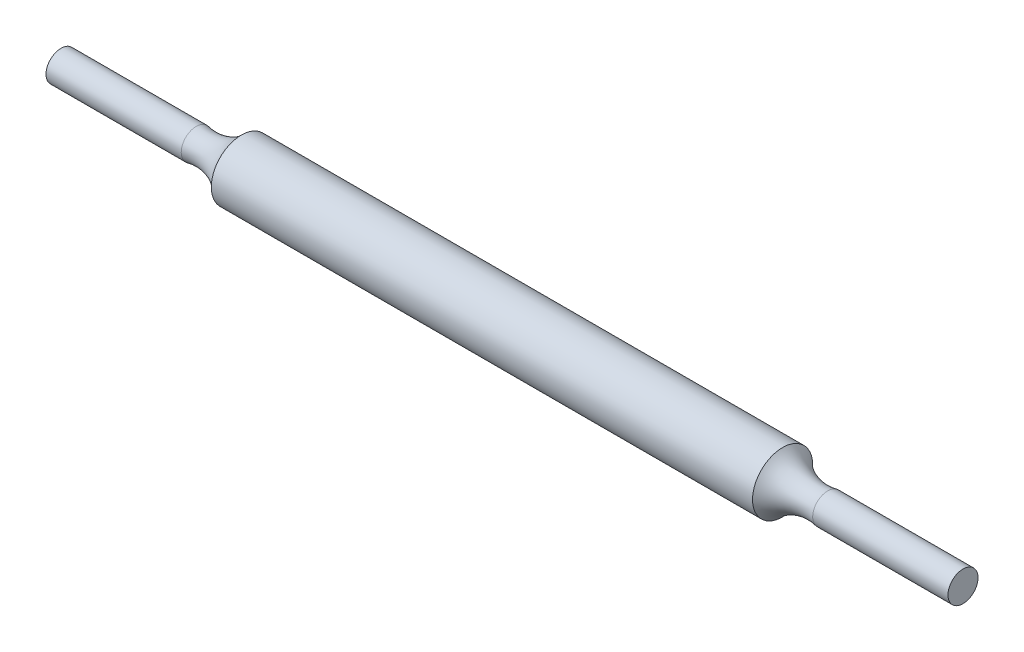
ISO-10303-21;
HEADER;
FILE_DESCRIPTION(('STEP AP214'),'2;1');
FILE_NAME('part.step','',(''),(''),'','','');
FILE_SCHEMA(('AUTOMOTIVE_DESIGN { 1 0 10303 214 1 1 1 1 }'));
ENDSEC;
DATA;
#1=APPLICATION_CONTEXT('core data for automotive mechanical design processes');
#2=APPLICATION_PROTOCOL_DEFINITION('international standard','automotive_design',2000,#1);
#3=PRODUCT_CONTEXT('',#1,'mechanical');
#4=PRODUCT('Part','Part','',(#3));
#5=PRODUCT_RELATED_PRODUCT_CATEGORY('part','',(#4));
#6=PRODUCT_DEFINITION_FORMATION('','',#4);
#7=PRODUCT_DEFINITION_CONTEXT('part definition',#1,'design');
#8=PRODUCT_DEFINITION('design','',#6,#7);
#9=PRODUCT_DEFINITION_SHAPE('','',#8);
#10=(LENGTH_UNIT() NAMED_UNIT(*) SI_UNIT(.MILLI.,.METRE.));
#11=(NAMED_UNIT(*) PLANE_ANGLE_UNIT() SI_UNIT($,.RADIAN.));
#12=(NAMED_UNIT(*) SI_UNIT($,.STERADIAN.) SOLID_ANGLE_UNIT());
#13=UNCERTAINTY_MEASURE_WITH_UNIT(LENGTH_MEASURE(1.E-05),#10,'distance_accuracy_value','');
#14=(GEOMETRIC_REPRESENTATION_CONTEXT(3) GLOBAL_UNCERTAINTY_ASSIGNED_CONTEXT((#13)) GLOBAL_UNIT_ASSIGNED_CONTEXT((#10,
#11,#12)) REPRESENTATION_CONTEXT('',''));
#15=CARTESIAN_POINT('',(0.,0.,0.));
#16=DIRECTION('',(0.,0.,1.));
#17=DIRECTION('',(1.,0.,0.));
#18=AXIS2_PLACEMENT_3D('',#15,#16,#17);
#19=CARTESIAN_POINT('',(30.0023926970627,0.,0.));
#20=DIRECTION('',(-1.,0.,0.));
#21=DIRECTION('',(0.,0.,1.));
#22=AXIS2_PLACEMENT_3D('',#19,#20,#21);
#23=PLANE('',#22);
#24=CARTESIAN_POINT('',(30.0023926970627,0.,0.));
#25=DIRECTION('',(-1.,0.,0.));
#26=DIRECTION('',(0.,0.,1.));
#27=AXIS2_PLACEMENT_3D('',#24,#25,#26);
#28=CIRCLE('',#27,1.);
#29=CARTESIAN_POINT('',(30.0023926970627,0.,1.));
#30=VERTEX_POINT('',#29);
#31=EDGE_CURVE('E57',#30,#30,#28,.T.);
#32=ORIENTED_EDGE('',*,*,#31,.F.);
#33=EDGE_LOOP('',(#32));
#34=FACE_BOUND('',#33,.T.);
#35=ADVANCED_FACE('F35',(#34),#23,.F.);
#36=CARTESIAN_POINT('',(-29.9976073029373,0.,0.));
#37=DIRECTION('',(1.,0.,0.));
#38=DIRECTION('',(0.,0.,-1.));
#39=AXIS2_PLACEMENT_3D('',#36,#37,#38);
#40=PLANE('',#39);
#41=CARTESIAN_POINT('',(-29.9976073029373,0.,0.));
#42=DIRECTION('',(-1.,0.,0.));
#43=DIRECTION('',(0.,0.,1.));
#44=AXIS2_PLACEMENT_3D('',#41,#42,#43);
#45=CIRCLE('',#44,0.999999999999994);
#46=CARTESIAN_POINT('',(-29.9976073029373,0.,0.999999999999994));
#47=VERTEX_POINT('',#46);
#48=EDGE_CURVE('E10',#47,#47,#45,.T.);
#49=ORIENTED_EDGE('',*,*,#48,.T.);
#50=EDGE_LOOP('',(#49));
#51=FACE_BOUND('',#50,.T.);
#52=ADVANCED_FACE('F64',(#51),#40,.F.);
#53=CARTESIAN_POINT('',(-29.9976073029373,0.,0.));
#54=DIRECTION('',(-1.,0.,0.));
#55=DIRECTION('',(0.,0.,1.));
#56=AXIS2_PLACEMENT_3D('',#53,#54,#55);
#57=CYLINDRICAL_SURFACE('',#56,0.999999999999997);
#58=ORIENTED_EDGE('',*,*,#48,.F.);
#59=EDGE_LOOP('',(#58));
#60=FACE_BOUND('',#59,.T.);
#61=CARTESIAN_POINT('',(-21.0023926970627,0.,0.));
#62=DIRECTION('',(-1.,0.,0.));
#63=DIRECTION('',(0.,0.,1.));
#64=AXIS2_PLACEMENT_3D('',#61,#62,#63);
#65=CIRCLE('',#64,1.);
#66=CARTESIAN_POINT('',(-21.0023926970627,0.,1.));
#67=VERTEX_POINT('',#66);
#68=EDGE_CURVE('E41',#67,#67,#65,.T.);
#69=ORIENTED_EDGE('',*,*,#68,.T.);
#70=EDGE_LOOP('',(#69));
#71=FACE_BOUND('',#70,.T.);
#72=ADVANCED_FACE('F68',(#60,#71),#57,.T.);
#73=CARTESIAN_POINT('',(-20.3466275182945,0.,0.));
#74=DIRECTION('',(-1.,0.,0.));
#75=DIRECTION('',(0.,0.,1.));
#76=AXIS2_PLACEMENT_3D('',#73,#74,#75);
#77=TOROIDAL_SURFACE('',#76,4.03270446369531,3.10279298919576);
#78=ORIENTED_EDGE('',*,*,#68,.F.);
#79=EDGE_LOOP('',(#78));
#80=FACE_BOUND('',#79,.T.);
#81=CARTESIAN_POINT('',(-18.0023926970627,0.,0.));
#82=DIRECTION('',(-1.,0.,0.));
#83=DIRECTION('',(0.,0.,1.));
#84=AXIS2_PLACEMENT_3D('',#81,#82,#83);
#85=CIRCLE('',#84,2.);
#86=CARTESIAN_POINT('',(-18.0023926970627,0.,2.));
#87=VERTEX_POINT('',#86);
#88=EDGE_CURVE('E45',#87,#87,#85,.T.);
#89=ORIENTED_EDGE('',*,*,#88,.T.);
#90=EDGE_LOOP('',(#89));
#91=FACE_BOUND('',#90,.T.);
#92=ADVANCED_FACE('F72',(#80,#91),#77,.F.);
#93=CARTESIAN_POINT('',(-29.9976073029373,0.,0.));
#94=DIRECTION('',(-1.,0.,0.));
#95=DIRECTION('',(0.,0.,1.));
#96=AXIS2_PLACEMENT_3D('',#93,#94,#95);
#97=CYLINDRICAL_SURFACE('',#96,2.);
#98=ORIENTED_EDGE('',*,*,#88,.F.);
#99=EDGE_LOOP('',(#98));
#100=FACE_BOUND('',#99,.T.);
#101=CARTESIAN_POINT('',(18.0023926970627,0.,0.));
#102=DIRECTION('',(-1.,0.,0.));
#103=DIRECTION('',(0.,0.,1.));
#104=AXIS2_PLACEMENT_3D('',#101,#102,#103);
#105=CIRCLE('',#104,2.);
#106=CARTESIAN_POINT('',(18.0023926970627,0.,2.));
#107=VERTEX_POINT('',#106);
#108=EDGE_CURVE('E49',#107,#107,#105,.T.);
#109=ORIENTED_EDGE('',*,*,#108,.T.);
#110=EDGE_LOOP('',(#109));
#111=FACE_BOUND('',#110,.T.);
#112=ADVANCED_FACE('F78',(#100,#111),#97,.T.);
#113=CARTESIAN_POINT('',(20.3466275182945,0.,0.));
#114=DIRECTION('',(-1.,0.,0.));
#115=DIRECTION('',(0.,0.,1.));
#116=AXIS2_PLACEMENT_3D('',#113,#114,#115);
#117=TOROIDAL_SURFACE('',#116,4.03270446369531,3.10279298919576);
#118=ORIENTED_EDGE('',*,*,#108,.F.);
#119=EDGE_LOOP('',(#118));
#120=FACE_BOUND('',#119,.T.);
#121=CARTESIAN_POINT('',(21.0023926970627,0.,0.));
#122=DIRECTION('',(-1.,0.,0.));
#123=DIRECTION('',(0.,0.,1.));
#124=AXIS2_PLACEMENT_3D('',#121,#122,#123);
#125=CIRCLE('',#124,1.);
#126=CARTESIAN_POINT('',(21.0023926970627,0.,1.));
#127=VERTEX_POINT('',#126);
#128=EDGE_CURVE('E54',#127,#127,#125,.T.);
#129=ORIENTED_EDGE('',*,*,#128,.T.);
#130=EDGE_LOOP('',(#129));
#131=FACE_BOUND('',#130,.T.);
#132=ADVANCED_FACE('F82',(#120,#131),#117,.F.);
#133=CARTESIAN_POINT('',(-29.9976073029373,0.,0.));
#134=DIRECTION('',(-1.,0.,0.));
#135=DIRECTION('',(0.,0.,1.));
#136=AXIS2_PLACEMENT_3D('',#133,#134,#135);
#137=CYLINDRICAL_SURFACE('',#136,1.);
#138=ORIENTED_EDGE('',*,*,#128,.F.);
#139=EDGE_LOOP('',(#138));
#140=FACE_BOUND('',#139,.T.);
#141=ORIENTED_EDGE('',*,*,#31,.T.);
#142=EDGE_LOOP('',(#141));
#143=FACE_BOUND('',#142,.T.);
#144=ADVANCED_FACE('F61',(#140,#143),#137,.T.);
#145=CLOSED_SHELL('',(#35,#52,#72,#92,#112,#132,#144));
#146=MANIFOLD_SOLID_BREP('B2',#145);
#147=ADVANCED_BREP_SHAPE_REPRESENTATION('',(#18,#146),#14);
#148=SHAPE_DEFINITION_REPRESENTATION(#9,#147);
ENDSEC;
END-ISO-10303-21;
